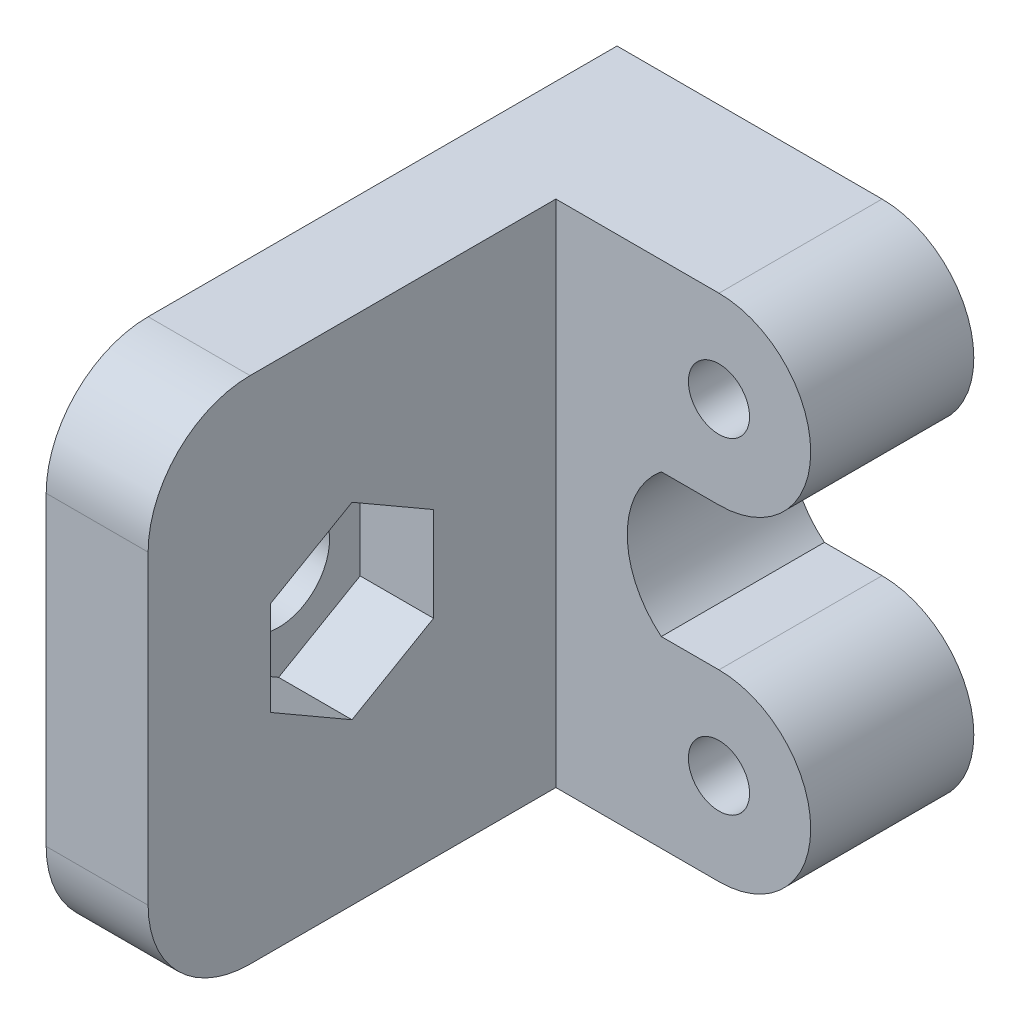
ISO-10303-21;
HEADER;
FILE_DESCRIPTION(('STEP AP214'),'2;1');
FILE_NAME('part.step','',(''),(''),'','','');
FILE_SCHEMA(('AUTOMOTIVE_DESIGN { 1 0 10303 214 1 1 1 1 }'));
ENDSEC;
DATA;
#1=APPLICATION_CONTEXT('core data for automotive mechanical design processes');
#2=APPLICATION_PROTOCOL_DEFINITION('international standard','automotive_design',2000,#1);
#3=PRODUCT_CONTEXT('',#1,'mechanical');
#4=PRODUCT('Part','Part','',(#3));
#5=PRODUCT_RELATED_PRODUCT_CATEGORY('part','',(#4));
#6=PRODUCT_DEFINITION_FORMATION('','',#4);
#7=PRODUCT_DEFINITION_CONTEXT('part definition',#1,'design');
#8=PRODUCT_DEFINITION('design','',#6,#7);
#9=PRODUCT_DEFINITION_SHAPE('','',#8);
#10=(LENGTH_UNIT() NAMED_UNIT(*) SI_UNIT(.MILLI.,.METRE.));
#11=(NAMED_UNIT(*) PLANE_ANGLE_UNIT() SI_UNIT($,.RADIAN.));
#12=(NAMED_UNIT(*) SI_UNIT($,.STERADIAN.) SOLID_ANGLE_UNIT());
#13=UNCERTAINTY_MEASURE_WITH_UNIT(LENGTH_MEASURE(1.E-05),#10,'distance_accuracy_value','');
#14=(GEOMETRIC_REPRESENTATION_CONTEXT(3) GLOBAL_UNCERTAINTY_ASSIGNED_CONTEXT((#13)) GLOBAL_UNIT_ASSIGNED_CONTEXT((#10,
#11,#12)) REPRESENTATION_CONTEXT('',''));
#15=CARTESIAN_POINT('',(0.,0.,0.));
#16=DIRECTION('',(0.,0.,1.));
#17=DIRECTION('',(1.,0.,0.));
#18=AXIS2_PLACEMENT_3D('',#15,#16,#17);
#19=CARTESIAN_POINT('',(-28.,8.,18.));
#20=DIRECTION('',(1.,0.,0.));
#21=DIRECTION('',(0.,0.,-1.));
#22=AXIS2_PLACEMENT_3D('',#19,#20,#21);
#23=CYLINDRICAL_SURFACE('',#22,2.5);
#24=CARTESIAN_POINT('',(-13.,8.,18.));
#25=DIRECTION('',(1.,0.,0.));
#26=DIRECTION('',(0.,0.,-1.));
#27=AXIS2_PLACEMENT_3D('',#24,#25,#26);
#28=CIRCLE('',#27,2.5);
#29=CARTESIAN_POINT('',(-13.,8.,15.5));
#30=VERTEX_POINT('',#29);
#31=EDGE_CURVE('E218',#30,#30,#28,.T.);
#32=ORIENTED_EDGE('',*,*,#31,.F.);
#33=EDGE_LOOP('',(#32));
#34=FACE_BOUND('',#33,.T.);
#35=CARTESIAN_POINT('',(-11.6,8.,18.));
#36=DIRECTION('',(1.,0.,0.));
#37=DIRECTION('',(0.,0.,-1.));
#38=AXIS2_PLACEMENT_3D('',#35,#36,#37);
#39=CIRCLE('',#38,2.5);
#40=CARTESIAN_POINT('',(-11.6,8.,15.5));
#41=VERTEX_POINT('',#40);
#42=EDGE_CURVE('E210',#41,#41,#39,.F.);
#43=ORIENTED_EDGE('',*,*,#42,.F.);
#44=EDGE_LOOP('',(#43));
#45=FACE_BOUND('',#44,.T.);
#46=ADVANCED_FACE('F33',(#34,#45),#23,.F.);
#47=CARTESIAN_POINT('',(0.,0.,8.));
#48=DIRECTION('',(0.,0.,1.));
#49=DIRECTION('',(1.,0.,0.));
#50=AXIS2_PLACEMENT_3D('',#47,#48,#49);
#51=PLANE('',#50);
#52=DIRECTION('',(0.,1.,0.));
#53=VECTOR('',#52,1.);
#54=CARTESIAN_POINT('',(-8.,-4.5,8.));
#55=LINE('',#54,#53);
#56=CARTESIAN_POINT('',(-8.,-4.5,8.));
#57=VERTEX_POINT('',#56);
#58=CARTESIAN_POINT('',(-8.,20.5,8.));
#59=VERTEX_POINT('',#58);
#60=EDGE_CURVE('E221',#57,#59,#55,.T.);
#61=ORIENTED_EDGE('',*,*,#60,.F.);
#62=DIRECTION('',(1.,0.,0.));
#63=VECTOR('',#62,1.);
#64=CARTESIAN_POINT('',(-13.,-4.5,8.));
#65=LINE('',#64,#63);
#66=CARTESIAN_POINT('',(0.,-4.5,8.));
#67=VERTEX_POINT('',#66);
#68=EDGE_CURVE('E247',#57,#67,#65,.T.);
#69=ORIENTED_EDGE('',*,*,#68,.T.);
#70=CARTESIAN_POINT('',(0.,0.,8.));
#71=DIRECTION('',(0.,0.,1.));
#72=DIRECTION('',(1.,0.,0.));
#73=AXIS2_PLACEMENT_3D('',#70,#71,#72);
#74=CIRCLE('',#73,4.5);
#75=CARTESIAN_POINT('',(0.,4.5,8.));
#76=VERTEX_POINT('',#75);
#77=EDGE_CURVE('E249',#67,#76,#74,.T.);
#78=ORIENTED_EDGE('',*,*,#77,.T.);
#79=DIRECTION('',(-1.,0.,0.));
#80=VECTOR('',#79,1.);
#81=CARTESIAN_POINT('',(0.,4.5,8.));
#82=LINE('',#81,#80);
#83=CARTESIAN_POINT('',(-2.82842712474619,4.5,8.));
#84=VERTEX_POINT('',#83);
#85=EDGE_CURVE('E252',#76,#84,#82,.T.);
#86=ORIENTED_EDGE('',*,*,#85,.T.);
#87=CARTESIAN_POINT('',(0.,8.,8.));
#88=DIRECTION('',(0.,0.,-1.));
#89=DIRECTION('',(1.,0.,0.));
#90=AXIS2_PLACEMENT_3D('',#87,#88,#89);
#91=CIRCLE('',#90,4.5);
#92=CARTESIAN_POINT('',(-2.82842712474619,11.5,8.));
#93=VERTEX_POINT('',#92);
#94=EDGE_CURVE('E254',#84,#93,#91,.T.);
#95=ORIENTED_EDGE('',*,*,#94,.T.);
#96=DIRECTION('',(1.,0.,0.));
#97=VECTOR('',#96,1.);
#98=CARTESIAN_POINT('',(0.,11.5,8.));
#99=LINE('',#98,#97);
#100=CARTESIAN_POINT('',(0.,11.5,8.));
#101=VERTEX_POINT('',#100);
#102=EDGE_CURVE('E256',#93,#101,#99,.T.);
#103=ORIENTED_EDGE('',*,*,#102,.T.);
#104=CARTESIAN_POINT('',(0.,16.,8.));
#105=DIRECTION('',(0.,0.,1.));
#106=DIRECTION('',(1.,0.,0.));
#107=AXIS2_PLACEMENT_3D('',#104,#105,#106);
#108=CIRCLE('',#107,4.5);
#109=CARTESIAN_POINT('',(0.,20.5,8.));
#110=VERTEX_POINT('',#109);
#111=EDGE_CURVE('E258',#101,#110,#108,.T.);
#112=ORIENTED_EDGE('',*,*,#111,.T.);
#113=DIRECTION('',(-1.,0.,0.));
#114=VECTOR('',#113,1.);
#115=CARTESIAN_POINT('',(-13.,20.5,8.));
#116=LINE('',#115,#114);
#117=EDGE_CURVE('E260',#110,#59,#116,.T.);
#118=ORIENTED_EDGE('',*,*,#117,.T.);
#119=EDGE_LOOP('',(#61,#69,#78,#86,#95,#103,#112,#118));
#120=FACE_BOUND('',#119,.T.);
#121=CARTESIAN_POINT('',(0.,0.,8.));
#122=DIRECTION('',(0.,0.,1.));
#123=DIRECTION('',(1.,0.,0.));
#124=AXIS2_PLACEMENT_3D('',#121,#122,#123);
#125=CIRCLE('',#124,1.5);
#126=CARTESIAN_POINT('',(1.5,0.,8.));
#127=VERTEX_POINT('',#126);
#128=EDGE_CURVE('E241',#127,#127,#125,.T.);
#129=ORIENTED_EDGE('',*,*,#128,.F.);
#130=EDGE_LOOP('',(#129));
#131=FACE_BOUND('',#130,.T.);
#132=CARTESIAN_POINT('',(0.,16.,8.));
#133=DIRECTION('',(0.,0.,1.));
#134=DIRECTION('',(1.,0.,0.));
#135=AXIS2_PLACEMENT_3D('',#132,#133,#134);
#136=CIRCLE('',#135,1.5);
#137=CARTESIAN_POINT('',(1.5,16.,8.));
#138=VERTEX_POINT('',#137);
#139=EDGE_CURVE('E235',#138,#138,#136,.T.);
#140=ORIENTED_EDGE('',*,*,#139,.F.);
#141=EDGE_LOOP('',(#140));
#142=FACE_BOUND('',#141,.T.);
#143=ADVANCED_FACE('F332',(#120,#131,#142),#51,.T.);
#144=CARTESIAN_POINT('',(0.,0.,0.));
#145=DIRECTION('',(0.,0.,1.));
#146=DIRECTION('',(1.,0.,0.));
#147=AXIS2_PLACEMENT_3D('',#144,#145,#146);
#148=PLANE('',#147);
#149=DIRECTION('',(1.,0.,0.));
#150=VECTOR('',#149,1.);
#151=CARTESIAN_POINT('',(-13.,-4.5,0.));
#152=LINE('',#151,#150);
#153=CARTESIAN_POINT('',(-13.,-4.5,0.));
#154=VERTEX_POINT('',#153);
#155=CARTESIAN_POINT('',(0.,-4.5,0.));
#156=VERTEX_POINT('',#155);
#157=EDGE_CURVE('E244',#154,#156,#152,.T.);
#158=ORIENTED_EDGE('',*,*,#157,.F.);
#159=DIRECTION('',(0.,-1.,0.));
#160=VECTOR('',#159,1.);
#161=CARTESIAN_POINT('',(-13.,-4.5,0.));
#162=LINE('',#161,#160);
#163=CARTESIAN_POINT('',(-13.,20.5,0.));
#164=VERTEX_POINT('',#163);
#165=EDGE_CURVE('E250',#164,#154,#162,.T.);
#166=ORIENTED_EDGE('',*,*,#165,.F.);
#167=DIRECTION('',(-1.,0.,0.));
#168=VECTOR('',#167,1.);
#169=CARTESIAN_POINT('',(-13.,20.5,0.));
#170=LINE('',#169,#168);
#171=CARTESIAN_POINT('',(0.,20.5,0.));
#172=VERTEX_POINT('',#171);
#173=EDGE_CURVE('E276',#172,#164,#170,.T.);
#174=ORIENTED_EDGE('',*,*,#173,.F.);
#175=CARTESIAN_POINT('',(0.,16.,0.));
#176=DIRECTION('',(0.,0.,1.));
#177=DIRECTION('',(1.,0.,0.));
#178=AXIS2_PLACEMENT_3D('',#175,#176,#177);
#179=CIRCLE('',#178,4.5);
#180=CARTESIAN_POINT('',(0.,11.5,0.));
#181=VERTEX_POINT('',#180);
#182=EDGE_CURVE('E274',#181,#172,#179,.T.);
#183=ORIENTED_EDGE('',*,*,#182,.F.);
#184=DIRECTION('',(1.,0.,0.));
#185=VECTOR('',#184,1.);
#186=CARTESIAN_POINT('',(0.,11.5,0.));
#187=LINE('',#186,#185);
#188=CARTESIAN_POINT('',(-2.82842712474619,11.5,0.));
#189=VERTEX_POINT('',#188);
#190=EDGE_CURVE('E272',#189,#181,#187,.T.);
#191=ORIENTED_EDGE('',*,*,#190,.F.);
#192=CARTESIAN_POINT('',(0.,8.,0.));
#193=DIRECTION('',(0.,0.,-1.));
#194=DIRECTION('',(1.,0.,0.));
#195=AXIS2_PLACEMENT_3D('',#192,#193,#194);
#196=CIRCLE('',#195,4.5);
#197=CARTESIAN_POINT('',(-2.82842712474619,4.5,0.));
#198=VERTEX_POINT('',#197);
#199=EDGE_CURVE('E270',#198,#189,#196,.T.);
#200=ORIENTED_EDGE('',*,*,#199,.F.);
#201=DIRECTION('',(-1.,0.,0.));
#202=VECTOR('',#201,1.);
#203=CARTESIAN_POINT('',(0.,4.5,0.));
#204=LINE('',#203,#202);
#205=CARTESIAN_POINT('',(0.,4.5,0.));
#206=VERTEX_POINT('',#205);
#207=EDGE_CURVE('E268',#206,#198,#204,.T.);
#208=ORIENTED_EDGE('',*,*,#207,.F.);
#209=CARTESIAN_POINT('',(0.,0.,0.));
#210=DIRECTION('',(0.,0.,1.));
#211=DIRECTION('',(1.,0.,0.));
#212=AXIS2_PLACEMENT_3D('',#209,#210,#211);
#213=CIRCLE('',#212,4.5);
#214=EDGE_CURVE('E266',#156,#206,#213,.T.);
#215=ORIENTED_EDGE('',*,*,#214,.F.);
#216=EDGE_LOOP('',(#158,#166,#174,#183,#191,#200,#208,#215));
#217=FACE_BOUND('',#216,.T.);
#218=CARTESIAN_POINT('',(0.,0.,0.));
#219=DIRECTION('',(0.,0.,1.));
#220=DIRECTION('',(1.,0.,0.));
#221=AXIS2_PLACEMENT_3D('',#218,#219,#220);
#222=CIRCLE('',#221,1.5);
#223=CARTESIAN_POINT('',(1.5,0.,0.));
#224=VERTEX_POINT('',#223);
#225=EDGE_CURVE('E238',#224,#224,#222,.T.);
#226=ORIENTED_EDGE('',*,*,#225,.T.);
#227=EDGE_LOOP('',(#226));
#228=FACE_BOUND('',#227,.T.);
#229=CARTESIAN_POINT('',(0.,16.,0.));
#230=DIRECTION('',(0.,0.,1.));
#231=DIRECTION('',(1.,0.,0.));
#232=AXIS2_PLACEMENT_3D('',#229,#230,#231);
#233=CIRCLE('',#232,1.5);
#234=CARTESIAN_POINT('',(1.5,16.,0.));
#235=VERTEX_POINT('',#234);
#236=EDGE_CURVE('E234',#235,#235,#233,.T.);
#237=ORIENTED_EDGE('',*,*,#236,.T.);
#238=EDGE_LOOP('',(#237));
#239=FACE_BOUND('',#238,.T.);
#240=ADVANCED_FACE('F368',(#217,#228,#239),#148,.F.);
#241=CARTESIAN_POINT('',(-13.,-4.5,8.));
#242=DIRECTION('',(0.,1.,0.));
#243=DIRECTION('',(0.,0.,1.));
#244=AXIS2_PLACEMENT_3D('',#241,#242,#243);
#245=PLANE('',#244);
#246=DIRECTION('',(0.,0.,-1.));
#247=VECTOR('',#246,1.);
#248=CARTESIAN_POINT('',(-8.,-4.5,28.));
#249=LINE('',#248,#247);
#250=CARTESIAN_POINT('',(-8.,-4.5,23.));
#251=VERTEX_POINT('',#250);
#252=EDGE_CURVE('E232',#251,#57,#249,.T.);
#253=ORIENTED_EDGE('',*,*,#252,.F.);
#254=DIRECTION('',(1.,0.,0.));
#255=VECTOR('',#254,1.);
#256=CARTESIAN_POINT('',(-13.,-4.5,23.));
#257=LINE('',#256,#255);
#258=CARTESIAN_POINT('',(-13.,-4.5,23.));
#259=VERTEX_POINT('',#258);
#260=EDGE_CURVE('E56',#251,#259,#257,.F.);
#261=ORIENTED_EDGE('',*,*,#260,.T.);
#262=DIRECTION('',(0.,0.,-1.));
#263=VECTOR('',#262,1.);
#264=CARTESIAN_POINT('',(-13.,-4.5,8.));
#265=LINE('',#264,#263);
#266=EDGE_CURVE('E263',#259,#154,#265,.T.);
#267=ORIENTED_EDGE('',*,*,#266,.T.);
#268=ORIENTED_EDGE('',*,*,#157,.T.);
#269=DIRECTION('',(0.,0.,-1.));
#270=VECTOR('',#269,1.);
#271=CARTESIAN_POINT('',(0.,-4.5,8.));
#272=LINE('',#271,#270);
#273=EDGE_CURVE('E299',#67,#156,#272,.T.);
#274=ORIENTED_EDGE('',*,*,#273,.F.);
#275=ORIENTED_EDGE('',*,*,#68,.F.);
#276=EDGE_LOOP('',(#253,#261,#267,#268,#274,#275));
#277=FACE_BOUND('',#276,.T.);
#278=ADVANCED_FACE('F328',(#277),#245,.F.);
#279=CARTESIAN_POINT('',(0.,0.,8.));
#280=DIRECTION('',(0.,0.,-1.));
#281=DIRECTION('',(-1.,0.,0.));
#282=AXIS2_PLACEMENT_3D('',#279,#280,#281);
#283=CYLINDRICAL_SURFACE('',#282,4.5);
#284=ORIENTED_EDGE('',*,*,#214,.T.);
#285=DIRECTION('',(0.,0.,-1.));
#286=VECTOR('',#285,1.);
#287=CARTESIAN_POINT('',(0.,4.5,8.));
#288=LINE('',#287,#286);
#289=EDGE_CURVE('E296',#76,#206,#288,.T.);
#290=ORIENTED_EDGE('',*,*,#289,.F.);
#291=ORIENTED_EDGE('',*,*,#77,.F.);
#292=ORIENTED_EDGE('',*,*,#273,.T.);
#293=EDGE_LOOP('',(#284,#290,#291,#292));
#294=FACE_BOUND('',#293,.T.);
#295=ADVANCED_FACE('F336',(#294),#283,.T.);
#296=CARTESIAN_POINT('',(0.,4.5,8.));
#297=DIRECTION('',(0.,-1.,0.));
#298=DIRECTION('',(0.,0.,-1.));
#299=AXIS2_PLACEMENT_3D('',#296,#297,#298);
#300=PLANE('',#299);
#301=ORIENTED_EDGE('',*,*,#207,.T.);
#302=DIRECTION('',(0.,0.,-1.));
#303=VECTOR('',#302,1.);
#304=CARTESIAN_POINT('',(-2.82842712474619,4.5,8.));
#305=LINE('',#304,#303);
#306=EDGE_CURVE('E293',#84,#198,#305,.T.);
#307=ORIENTED_EDGE('',*,*,#306,.F.);
#308=ORIENTED_EDGE('',*,*,#85,.F.);
#309=ORIENTED_EDGE('',*,*,#289,.T.);
#310=EDGE_LOOP('',(#301,#307,#308,#309));
#311=FACE_BOUND('',#310,.T.);
#312=ADVANCED_FACE('F341',(#311),#300,.F.);
#313=CARTESIAN_POINT('',(0.,8.,8.));
#314=DIRECTION('',(0.,0.,-1.));
#315=DIRECTION('',(-1.,0.,0.));
#316=AXIS2_PLACEMENT_3D('',#313,#314,#315);
#317=CYLINDRICAL_SURFACE('',#316,4.5);
#318=ORIENTED_EDGE('',*,*,#199,.T.);
#319=DIRECTION('',(0.,0.,-1.));
#320=VECTOR('',#319,1.);
#321=CARTESIAN_POINT('',(-2.82842712474619,11.5,8.));
#322=LINE('',#321,#320);
#323=EDGE_CURVE('E290',#93,#189,#322,.T.);
#324=ORIENTED_EDGE('',*,*,#323,.F.);
#325=ORIENTED_EDGE('',*,*,#94,.F.);
#326=ORIENTED_EDGE('',*,*,#306,.T.);
#327=EDGE_LOOP('',(#318,#324,#325,#326));
#328=FACE_BOUND('',#327,.T.);
#329=ADVANCED_FACE('F347',(#328),#317,.F.);
#330=CARTESIAN_POINT('',(0.,11.5,8.));
#331=DIRECTION('',(0.,1.,0.));
#332=DIRECTION('',(0.,0.,1.));
#333=AXIS2_PLACEMENT_3D('',#330,#331,#332);
#334=PLANE('',#333);
#335=ORIENTED_EDGE('',*,*,#190,.T.);
#336=DIRECTION('',(0.,0.,-1.));
#337=VECTOR('',#336,1.);
#338=CARTESIAN_POINT('',(0.,11.5,8.));
#339=LINE('',#338,#337);
#340=EDGE_CURVE('E287',#101,#181,#339,.T.);
#341=ORIENTED_EDGE('',*,*,#340,.F.);
#342=ORIENTED_EDGE('',*,*,#102,.F.);
#343=ORIENTED_EDGE('',*,*,#323,.T.);
#344=EDGE_LOOP('',(#335,#341,#342,#343));
#345=FACE_BOUND('',#344,.T.);
#346=ADVANCED_FACE('F351',(#345),#334,.F.);
#347=CARTESIAN_POINT('',(0.,16.,8.));
#348=DIRECTION('',(0.,0.,-1.));
#349=DIRECTION('',(-1.,0.,0.));
#350=AXIS2_PLACEMENT_3D('',#347,#348,#349);
#351=CYLINDRICAL_SURFACE('',#350,4.5);
#352=ORIENTED_EDGE('',*,*,#182,.T.);
#353=DIRECTION('',(0.,0.,-1.));
#354=VECTOR('',#353,1.);
#355=CARTESIAN_POINT('',(0.,20.5,8.));
#356=LINE('',#355,#354);
#357=EDGE_CURVE('E284',#110,#172,#356,.T.);
#358=ORIENTED_EDGE('',*,*,#357,.F.);
#359=ORIENTED_EDGE('',*,*,#111,.F.);
#360=ORIENTED_EDGE('',*,*,#340,.T.);
#361=EDGE_LOOP('',(#352,#358,#359,#360));
#362=FACE_BOUND('',#361,.T.);
#363=ADVANCED_FACE('F356',(#362),#351,.T.);
#364=CARTESIAN_POINT('',(-13.,20.5,8.));
#365=DIRECTION('',(0.,-1.,0.));
#366=DIRECTION('',(0.,0.,-1.));
#367=AXIS2_PLACEMENT_3D('',#364,#365,#366);
#368=PLANE('',#367);
#369=DIRECTION('',(0.,0.,-1.));
#370=VECTOR('',#369,1.);
#371=CARTESIAN_POINT('',(-13.,20.5,8.));
#372=LINE('',#371,#370);
#373=CARTESIAN_POINT('',(-13.,20.5,23.));
#374=VERTEX_POINT('',#373);
#375=EDGE_CURVE('E282',#374,#164,#372,.T.);
#376=ORIENTED_EDGE('',*,*,#375,.F.);
#377=DIRECTION('',(-1.,0.,0.));
#378=VECTOR('',#377,1.);
#379=CARTESIAN_POINT('',(-13.,20.5,23.));
#380=LINE('',#379,#378);
#381=CARTESIAN_POINT('',(-8.,20.5,23.));
#382=VERTEX_POINT('',#381);
#383=EDGE_CURVE('E11',#374,#382,#380,.F.);
#384=ORIENTED_EDGE('',*,*,#383,.T.);
#385=DIRECTION('',(0.,0.,-1.));
#386=VECTOR('',#385,1.);
#387=CARTESIAN_POINT('',(-8.,20.5,28.));
#388=LINE('',#387,#386);
#389=EDGE_CURVE('E228',#382,#59,#388,.T.);
#390=ORIENTED_EDGE('',*,*,#389,.T.);
#391=ORIENTED_EDGE('',*,*,#117,.F.);
#392=ORIENTED_EDGE('',*,*,#357,.T.);
#393=ORIENTED_EDGE('',*,*,#173,.T.);
#394=EDGE_LOOP('',(#376,#384,#390,#391,#392,#393));
#395=FACE_BOUND('',#394,.T.);
#396=ADVANCED_FACE('F363',(#395),#368,.F.);
#397=CARTESIAN_POINT('',(-13.,-4.5,8.));
#398=DIRECTION('',(1.,0.,0.));
#399=DIRECTION('',(0.,0.,-1.));
#400=AXIS2_PLACEMENT_3D('',#397,#398,#399);
#401=PLANE('',#400);
#402=ORIENTED_EDGE('',*,*,#31,.T.);
#403=EDGE_LOOP('',(#402));
#404=FACE_BOUND('',#403,.T.);
#405=ORIENTED_EDGE('',*,*,#266,.F.);
#406=CARTESIAN_POINT('',(-13.,0.5,23.));
#407=DIRECTION('',(1.,0.,0.));
#408=DIRECTION('',(0.,0.,-1.));
#409=AXIS2_PLACEMENT_3D('',#406,#407,#408);
#410=CIRCLE('',#409,5.);
#411=CARTESIAN_POINT('',(-13.,0.5,28.));
#412=VERTEX_POINT('',#411);
#413=EDGE_CURVE('E41',#259,#412,#410,.F.);
#414=ORIENTED_EDGE('',*,*,#413,.T.);
#415=DIRECTION('',(0.,-1.,0.));
#416=VECTOR('',#415,1.);
#417=CARTESIAN_POINT('',(-13.,-4.5,28.));
#418=LINE('',#417,#416);
#419=CARTESIAN_POINT('',(-13.,15.5,28.));
#420=VERTEX_POINT('',#419);
#421=EDGE_CURVE('E222',#420,#412,#418,.T.);
#422=ORIENTED_EDGE('',*,*,#421,.F.);
#423=CARTESIAN_POINT('',(-13.,15.5,23.));
#424=DIRECTION('',(1.,0.,0.));
#425=DIRECTION('',(0.,0.,-1.));
#426=AXIS2_PLACEMENT_3D('',#423,#424,#425);
#427=CIRCLE('',#426,5.);
#428=EDGE_CURVE('E48',#420,#374,#427,.F.);
#429=ORIENTED_EDGE('',*,*,#428,.T.);
#430=ORIENTED_EDGE('',*,*,#375,.T.);
#431=ORIENTED_EDGE('',*,*,#165,.T.);
#432=EDGE_LOOP('',(#405,#414,#422,#429,#430,#431));
#433=FACE_BOUND('',#432,.T.);
#434=ADVANCED_FACE('F316',(#404,#433),#401,.F.);
#435=CARTESIAN_POINT('',(0.,0.,8.));
#436=DIRECTION('',(0.,0.,-1.));
#437=DIRECTION('',(-1.,0.,0.));
#438=AXIS2_PLACEMENT_3D('',#435,#436,#437);
#439=CYLINDRICAL_SURFACE('',#438,1.5);
#440=ORIENTED_EDGE('',*,*,#128,.T.);
#441=EDGE_LOOP('',(#440));
#442=FACE_BOUND('',#441,.T.);
#443=ORIENTED_EDGE('',*,*,#225,.F.);
#444=EDGE_LOOP('',(#443));
#445=FACE_BOUND('',#444,.T.);
#446=ADVANCED_FACE('F378',(#442,#445),#439,.F.);
#447=CARTESIAN_POINT('',(0.,16.,8.));
#448=DIRECTION('',(0.,0.,-1.));
#449=DIRECTION('',(-1.,0.,0.));
#450=AXIS2_PLACEMENT_3D('',#447,#448,#449);
#451=CYLINDRICAL_SURFACE('',#450,1.5);
#452=ORIENTED_EDGE('',*,*,#139,.T.);
#453=EDGE_LOOP('',(#452));
#454=FACE_BOUND('',#453,.T.);
#455=ORIENTED_EDGE('',*,*,#236,.F.);
#456=EDGE_LOOP('',(#455));
#457=FACE_BOUND('',#456,.T.);
#458=ADVANCED_FACE('F376',(#454,#457),#451,.F.);
#459=CARTESIAN_POINT('',(-8.,-4.5,28.));
#460=DIRECTION('',(-1.,0.,0.));
#461=DIRECTION('',(0.,0.,1.));
#462=AXIS2_PLACEMENT_3D('',#459,#460,#461);
#463=PLANE('',#462);
#464=DIRECTION('',(0.,0.500000000000001,-0.866025403784438));
#465=VECTOR('',#464,1.);
#466=CARTESIAN_POINT('',(-8.,3.381197846483,18.));
#467=LINE('',#466,#465);
#468=CARTESIAN_POINT('',(-8.,3.381197846483,18.));
#469=VERTEX_POINT('',#468);
#470=CARTESIAN_POINT('',(-8.,5.6905989232415,14.));
#471=VERTEX_POINT('',#470);
#472=EDGE_CURVE('E198',#469,#471,#467,.T.);
#473=ORIENTED_EDGE('',*,*,#472,.F.);
#474=DIRECTION('',(0.,-0.499999999999999,-0.866025403784439));
#475=VECTOR('',#474,1.);
#476=CARTESIAN_POINT('',(-8.,5.6905989232415,22.));
#477=LINE('',#476,#475);
#478=CARTESIAN_POINT('',(-8.,5.6905989232415,22.));
#479=VERTEX_POINT('',#478);
#480=EDGE_CURVE('E165',#479,#469,#477,.T.);
#481=ORIENTED_EDGE('',*,*,#480,.F.);
#482=DIRECTION('',(0.,-1.,0.));
#483=VECTOR('',#482,1.);
#484=CARTESIAN_POINT('',(-8.,10.3094010767585,22.));
#485=LINE('',#484,#483);
#486=CARTESIAN_POINT('',(-8.,10.3094010767585,22.));
#487=VERTEX_POINT('',#486);
#488=EDGE_CURVE('E184',#487,#479,#485,.T.);
#489=ORIENTED_EDGE('',*,*,#488,.F.);
#490=DIRECTION('',(0.,-0.500000000000001,0.866025403784438));
#491=VECTOR('',#490,1.);
#492=CARTESIAN_POINT('',(-8.,12.618802153517,18.));
#493=LINE('',#492,#491);
#494=CARTESIAN_POINT('',(-8.,12.618802153517,18.));
#495=VERTEX_POINT('',#494);
#496=EDGE_CURVE('E187',#495,#487,#493,.T.);
#497=ORIENTED_EDGE('',*,*,#496,.F.);
#498=DIRECTION('',(0.,0.499999999999999,0.866025403784439));
#499=VECTOR('',#498,1.);
#500=CARTESIAN_POINT('',(-8.,10.3094010767585,14.));
#501=LINE('',#500,#499);
#502=CARTESIAN_POINT('',(-8.,10.3094010767585,14.));
#503=VERTEX_POINT('',#502);
#504=EDGE_CURVE('E203',#503,#495,#501,.T.);
#505=ORIENTED_EDGE('',*,*,#504,.F.);
#506=DIRECTION('',(0.,1.,0.));
#507=VECTOR('',#506,1.);
#508=CARTESIAN_POINT('',(-8.,5.6905989232415,14.));
#509=LINE('',#508,#507);
#510=EDGE_CURVE('E200',#471,#503,#509,.T.);
#511=ORIENTED_EDGE('',*,*,#510,.F.);
#512=EDGE_LOOP('',(#473,#481,#489,#497,#505,#511));
#513=FACE_BOUND('',#512,.T.);
#514=DIRECTION('',(0.,1.,0.));
#515=VECTOR('',#514,1.);
#516=CARTESIAN_POINT('',(-8.,-4.5,28.));
#517=LINE('',#516,#515);
#518=CARTESIAN_POINT('',(-8.,0.5,28.));
#519=VERTEX_POINT('',#518);
#520=CARTESIAN_POINT('',(-8.,15.5,28.));
#521=VERTEX_POINT('',#520);
#522=EDGE_CURVE('E225',#519,#521,#517,.T.);
#523=ORIENTED_EDGE('',*,*,#522,.F.);
#524=CARTESIAN_POINT('',(-8.,0.5,23.));
#525=DIRECTION('',(-1.,0.,0.));
#526=DIRECTION('',(0.,0.,1.));
#527=AXIS2_PLACEMENT_3D('',#524,#525,#526);
#528=CIRCLE('',#527,5.);
#529=EDGE_CURVE('E312',#519,#251,#528,.F.);
#530=ORIENTED_EDGE('',*,*,#529,.T.);
#531=ORIENTED_EDGE('',*,*,#252,.T.);
#532=ORIENTED_EDGE('',*,*,#60,.T.);
#533=ORIENTED_EDGE('',*,*,#389,.F.);
#534=CARTESIAN_POINT('',(-8.,15.5,23.));
#535=DIRECTION('',(-1.,0.,0.));
#536=DIRECTION('',(0.,0.,1.));
#537=AXIS2_PLACEMENT_3D('',#534,#535,#536);
#538=CIRCLE('',#537,5.);
#539=EDGE_CURVE('E310',#382,#521,#538,.F.);
#540=ORIENTED_EDGE('',*,*,#539,.T.);
#541=EDGE_LOOP('',(#523,#530,#531,#532,#533,#540));
#542=FACE_BOUND('',#541,.T.);
#543=ADVANCED_FACE('F325',(#513,#542),#463,.F.);
#544=CARTESIAN_POINT('',(0.,0.,28.));
#545=DIRECTION('',(0.,0.,-1.));
#546=DIRECTION('',(-1.,0.,0.));
#547=AXIS2_PLACEMENT_3D('',#544,#545,#546);
#548=PLANE('',#547);
#549=ORIENTED_EDGE('',*,*,#421,.T.);
#550=DIRECTION('',(1.,0.,0.));
#551=VECTOR('',#550,1.);
#552=CARTESIAN_POINT('',(0.,0.5,28.));
#553=LINE('',#552,#551);
#554=EDGE_CURVE('E307',#412,#519,#553,.T.);
#555=ORIENTED_EDGE('',*,*,#554,.T.);
#556=ORIENTED_EDGE('',*,*,#522,.T.);
#557=DIRECTION('',(-1.,0.,0.));
#558=VECTOR('',#557,1.);
#559=CARTESIAN_POINT('',(0.,15.5,28.));
#560=LINE('',#559,#558);
#561=EDGE_CURVE('E302',#521,#420,#560,.T.);
#562=ORIENTED_EDGE('',*,*,#561,.T.);
#563=EDGE_LOOP('',(#549,#555,#556,#562));
#564=FACE_BOUND('',#563,.T.);
#565=ADVANCED_FACE('F320',(#564),#548,.F.);
#566=CARTESIAN_POINT('',(-11.6,0.,0.));
#567=DIRECTION('',(1.,0.,0.));
#568=DIRECTION('',(0.,0.,-1.));
#569=AXIS2_PLACEMENT_3D('',#566,#567,#568);
#570=PLANE('',#569);
#571=DIRECTION('',(0.,-0.499999999999999,-0.866025403784439));
#572=VECTOR('',#571,1.);
#573=CARTESIAN_POINT('',(-11.6,5.6905989232415,22.));
#574=LINE('',#573,#572);
#575=CARTESIAN_POINT('',(-11.6,5.6905989232415,22.));
#576=VERTEX_POINT('',#575);
#577=CARTESIAN_POINT('',(-11.6,3.381197846483,18.));
#578=VERTEX_POINT('',#577);
#579=EDGE_CURVE('E162',#576,#578,#574,.T.);
#580=ORIENTED_EDGE('',*,*,#579,.T.);
#581=DIRECTION('',(0.,0.500000000000001,-0.866025403784438));
#582=VECTOR('',#581,1.);
#583=CARTESIAN_POINT('',(-11.6,3.381197846483,18.));
#584=LINE('',#583,#582);
#585=CARTESIAN_POINT('',(-11.6,5.6905989232415,14.));
#586=VERTEX_POINT('',#585);
#587=EDGE_CURVE('E173',#578,#586,#584,.T.);
#588=ORIENTED_EDGE('',*,*,#587,.T.);
#589=DIRECTION('',(0.,1.,0.));
#590=VECTOR('',#589,1.);
#591=CARTESIAN_POINT('',(-11.6,5.6905989232415,14.));
#592=LINE('',#591,#590);
#593=CARTESIAN_POINT('',(-11.6,10.3094010767585,14.));
#594=VERTEX_POINT('',#593);
#595=EDGE_CURVE('E178',#586,#594,#592,.T.);
#596=ORIENTED_EDGE('',*,*,#595,.T.);
#597=DIRECTION('',(0.,0.499999999999999,0.866025403784439));
#598=VECTOR('',#597,1.);
#599=CARTESIAN_POINT('',(-11.6,10.3094010767585,14.));
#600=LINE('',#599,#598);
#601=CARTESIAN_POINT('',(-11.6,12.618802153517,18.));
#602=VERTEX_POINT('',#601);
#603=EDGE_CURVE('E191',#594,#602,#600,.T.);
#604=ORIENTED_EDGE('',*,*,#603,.T.);
#605=DIRECTION('',(0.,-0.500000000000001,0.866025403784438));
#606=VECTOR('',#605,1.);
#607=CARTESIAN_POINT('',(-11.6,12.618802153517,18.));
#608=LINE('',#607,#606);
#609=CARTESIAN_POINT('',(-11.6,10.3094010767585,22.));
#610=VERTEX_POINT('',#609);
#611=EDGE_CURVE('E194',#602,#610,#608,.T.);
#612=ORIENTED_EDGE('',*,*,#611,.T.);
#613=DIRECTION('',(0.,-1.,0.));
#614=VECTOR('',#613,1.);
#615=CARTESIAN_POINT('',(-11.6,10.3094010767585,22.));
#616=LINE('',#615,#614);
#617=EDGE_CURVE('E170',#610,#576,#616,.T.);
#618=ORIENTED_EDGE('',*,*,#617,.T.);
#619=EDGE_LOOP('',(#580,#588,#596,#604,#612,#618));
#620=FACE_BOUND('',#619,.T.);
#621=ORIENTED_EDGE('',*,*,#42,.T.);
#622=EDGE_LOOP('',(#621));
#623=FACE_BOUND('',#622,.T.);
#624=ADVANCED_FACE('F180',(#620,#623),#570,.T.);
#625=CARTESIAN_POINT('',(-11.6,5.6905989232415,22.));
#626=DIRECTION('',(0.,-0.866025403784439,0.499999999999999));
#627=DIRECTION('',(0.,-0.499999999999999,-0.866025403784439));
#628=AXIS2_PLACEMENT_3D('',#625,#626,#627);
#629=PLANE('',#628);
#630=ORIENTED_EDGE('',*,*,#480,.T.);
#631=DIRECTION('',(1.,0.,0.));
#632=VECTOR('',#631,1.);
#633=CARTESIAN_POINT('',(-11.6,3.381197846483,18.));
#634=LINE('',#633,#632);
#635=EDGE_CURVE('E158',#578,#469,#634,.T.);
#636=ORIENTED_EDGE('',*,*,#635,.F.);
#637=ORIENTED_EDGE('',*,*,#579,.F.);
#638=DIRECTION('',(1.,0.,0.));
#639=VECTOR('',#638,1.);
#640=CARTESIAN_POINT('',(-11.6,5.6905989232415,22.));
#641=LINE('',#640,#639);
#642=EDGE_CURVE('E208',#576,#479,#641,.T.);
#643=ORIENTED_EDGE('',*,*,#642,.T.);
#644=EDGE_LOOP('',(#630,#636,#637,#643));
#645=FACE_BOUND('',#644,.T.);
#646=ADVANCED_FACE('F160',(#645),#629,.F.);
#647=CARTESIAN_POINT('',(-11.6,10.3094010767585,22.));
#648=DIRECTION('',(0.,0.,1.));
#649=DIRECTION('',(0.,-1.,0.));
#650=AXIS2_PLACEMENT_3D('',#647,#648,#649);
#651=PLANE('',#650);
#652=ORIENTED_EDGE('',*,*,#488,.T.);
#653=ORIENTED_EDGE('',*,*,#642,.F.);
#654=ORIENTED_EDGE('',*,*,#617,.F.);
#655=DIRECTION('',(1.,0.,0.));
#656=VECTOR('',#655,1.);
#657=CARTESIAN_POINT('',(-11.6,10.3094010767585,22.));
#658=LINE('',#657,#656);
#659=EDGE_CURVE('E211',#610,#487,#658,.T.);
#660=ORIENTED_EDGE('',*,*,#659,.T.);
#661=EDGE_LOOP('',(#652,#653,#654,#660));
#662=FACE_BOUND('',#661,.T.);
#663=ADVANCED_FACE('F409',(#662),#651,.F.);
#664=CARTESIAN_POINT('',(-11.6,12.618802153517,18.));
#665=DIRECTION('',(0.,0.866025403784438,0.500000000000001));
#666=DIRECTION('',(0.,-0.500000000000001,0.866025403784438));
#667=AXIS2_PLACEMENT_3D('',#664,#665,#666);
#668=PLANE('',#667);
#669=ORIENTED_EDGE('',*,*,#496,.T.);
#670=ORIENTED_EDGE('',*,*,#659,.F.);
#671=ORIENTED_EDGE('',*,*,#611,.F.);
#672=DIRECTION('',(1.,0.,0.));
#673=VECTOR('',#672,1.);
#674=CARTESIAN_POINT('',(-11.6,12.618802153517,18.));
#675=LINE('',#674,#673);
#676=EDGE_CURVE('E213',#602,#495,#675,.T.);
#677=ORIENTED_EDGE('',*,*,#676,.T.);
#678=EDGE_LOOP('',(#669,#670,#671,#677));
#679=FACE_BOUND('',#678,.T.);
#680=ADVANCED_FACE('F413',(#679),#668,.F.);
#681=CARTESIAN_POINT('',(-11.6,10.3094010767585,14.));
#682=DIRECTION('',(0.,0.866025403784439,-0.499999999999999));
#683=DIRECTION('',(0.,0.499999999999999,0.866025403784439));
#684=AXIS2_PLACEMENT_3D('',#681,#682,#683);
#685=PLANE('',#684);
#686=ORIENTED_EDGE('',*,*,#504,.T.);
#687=ORIENTED_EDGE('',*,*,#676,.F.);
#688=ORIENTED_EDGE('',*,*,#603,.F.);
#689=DIRECTION('',(1.,0.,0.));
#690=VECTOR('',#689,1.);
#691=CARTESIAN_POINT('',(-11.6,10.3094010767585,14.));
#692=LINE('',#691,#690);
#693=EDGE_CURVE('E215',#594,#503,#692,.T.);
#694=ORIENTED_EDGE('',*,*,#693,.T.);
#695=EDGE_LOOP('',(#686,#687,#688,#694));
#696=FACE_BOUND('',#695,.T.);
#697=ADVANCED_FACE('F417',(#696),#685,.F.);
#698=CARTESIAN_POINT('',(-11.6,5.6905989232415,14.));
#699=DIRECTION('',(0.,0.,-1.));
#700=DIRECTION('',(0.,1.,0.));
#701=AXIS2_PLACEMENT_3D('',#698,#699,#700);
#702=PLANE('',#701);
#703=ORIENTED_EDGE('',*,*,#510,.T.);
#704=ORIENTED_EDGE('',*,*,#693,.F.);
#705=ORIENTED_EDGE('',*,*,#595,.F.);
#706=DIRECTION('',(1.,0.,0.));
#707=VECTOR('',#706,1.);
#708=CARTESIAN_POINT('',(-11.6,5.6905989232415,14.));
#709=LINE('',#708,#707);
#710=EDGE_CURVE('E169',#586,#471,#709,.T.);
#711=ORIENTED_EDGE('',*,*,#710,.T.);
#712=EDGE_LOOP('',(#703,#704,#705,#711));
#713=FACE_BOUND('',#712,.T.);
#714=ADVANCED_FACE('F421',(#713),#702,.F.);
#715=CARTESIAN_POINT('',(-11.6,3.381197846483,18.));
#716=DIRECTION('',(0.,-0.866025403784438,-0.500000000000001));
#717=DIRECTION('',(0.,0.500000000000001,-0.866025403784438));
#718=AXIS2_PLACEMENT_3D('',#715,#716,#717);
#719=PLANE('',#718);
#720=ORIENTED_EDGE('',*,*,#472,.T.);
#721=ORIENTED_EDGE('',*,*,#710,.F.);
#722=ORIENTED_EDGE('',*,*,#587,.F.);
#723=ORIENTED_EDGE('',*,*,#635,.T.);
#724=EDGE_LOOP('',(#720,#721,#722,#723));
#725=FACE_BOUND('',#724,.T.);
#726=ADVANCED_FACE('F174',(#725),#719,.F.);
#727=CARTESIAN_POINT('',(0.,0.5,23.));
#728=DIRECTION('',(1.,0.,0.));
#729=DIRECTION('',(0.,0.,-1.));
#730=AXIS2_PLACEMENT_3D('',#727,#728,#729);
#731=CYLINDRICAL_SURFACE('',#730,5.);
#732=ORIENTED_EDGE('',*,*,#413,.F.);
#733=ORIENTED_EDGE('',*,*,#260,.F.);
#734=ORIENTED_EDGE('',*,*,#529,.F.);
#735=ORIENTED_EDGE('',*,*,#554,.F.);
#736=EDGE_LOOP('',(#732,#733,#734,#735));
#737=FACE_BOUND('',#736,.T.);
#738=ADVANCED_FACE('F323',(#737),#731,.T.);
#739=CARTESIAN_POINT('',(0.,15.5,23.));
#740=DIRECTION('',(-1.,0.,0.));
#741=DIRECTION('',(0.,0.,1.));
#742=AXIS2_PLACEMENT_3D('',#739,#740,#741);
#743=CYLINDRICAL_SURFACE('',#742,5.);
#744=ORIENTED_EDGE('',*,*,#539,.F.);
#745=ORIENTED_EDGE('',*,*,#383,.F.);
#746=ORIENTED_EDGE('',*,*,#428,.F.);
#747=ORIENTED_EDGE('',*,*,#561,.F.);
#748=EDGE_LOOP('',(#744,#745,#746,#747));
#749=FACE_BOUND('',#748,.T.);
#750=ADVANCED_FACE('F35',(#749),#743,.T.);
#751=CLOSED_SHELL('',(#46,#143,#240,#278,#295,#312,#329,#346,#363,#396,#434,#446,#458,#543,#565,
#624,#646,#663,#680,#697,#714,#726,#738,#750));
#752=MANIFOLD_SOLID_BREP('B2',#751);
#753=ADVANCED_BREP_SHAPE_REPRESENTATION('',(#18,#752),#14);
#754=SHAPE_DEFINITION_REPRESENTATION(#9,#753);
ENDSEC;
END-ISO-10303-21;
